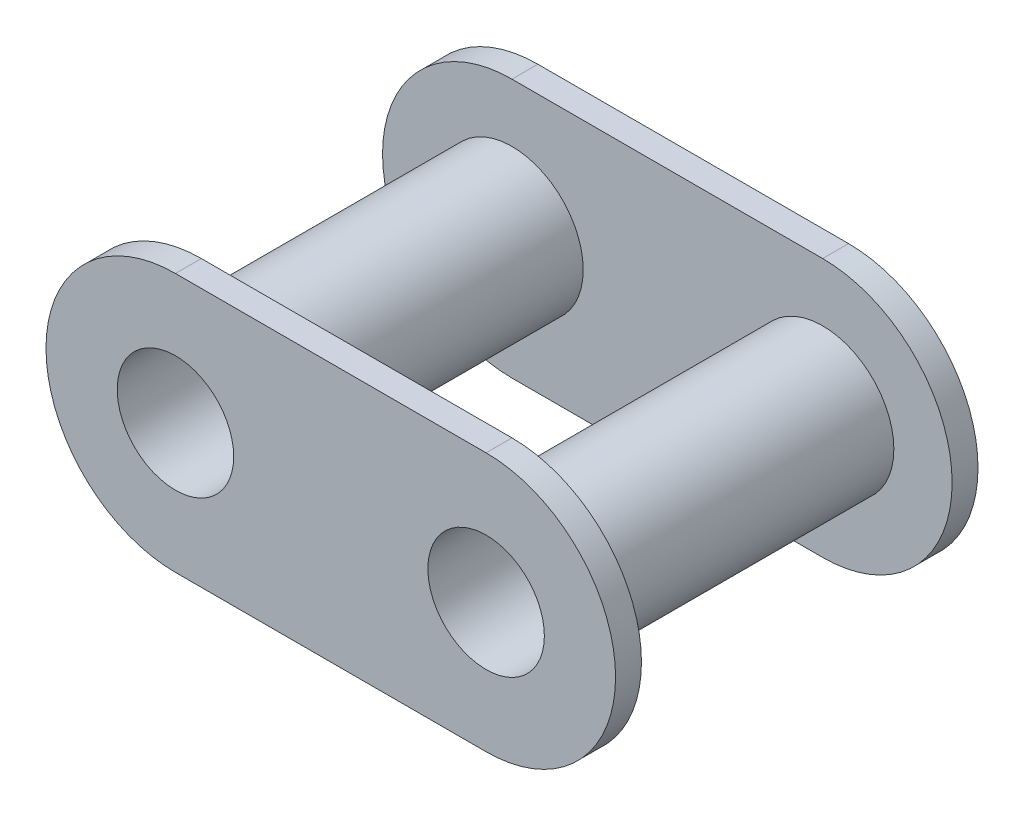
ISO-10303-21;
HEADER;
FILE_DESCRIPTION(('STEP AP214'),'2;1');
FILE_NAME('part.step','',(''),(''),'','','');
FILE_SCHEMA(('AUTOMOTIVE_DESIGN { 1 0 10303 214 1 1 1 1 }'));
ENDSEC;
DATA;
#1=APPLICATION_CONTEXT('core data for automotive mechanical design processes');
#2=APPLICATION_PROTOCOL_DEFINITION('international standard','automotive_design',2000,#1);
#3=PRODUCT_CONTEXT('',#1,'mechanical');
#4=PRODUCT('Part','Part','',(#3));
#5=PRODUCT_RELATED_PRODUCT_CATEGORY('part','',(#4));
#6=PRODUCT_DEFINITION_FORMATION('','',#4);
#7=PRODUCT_DEFINITION_CONTEXT('part definition',#1,'design');
#8=PRODUCT_DEFINITION('design','',#6,#7);
#9=PRODUCT_DEFINITION_SHAPE('','',#8);
#10=(LENGTH_UNIT() NAMED_UNIT(*) SI_UNIT(.MILLI.,.METRE.));
#11=(NAMED_UNIT(*) PLANE_ANGLE_UNIT() SI_UNIT($,.RADIAN.));
#12=(NAMED_UNIT(*) SI_UNIT($,.STERADIAN.) SOLID_ANGLE_UNIT());
#13=UNCERTAINTY_MEASURE_WITH_UNIT(LENGTH_MEASURE(1.E-05),#10,'distance_accuracy_value','');
#14=(GEOMETRIC_REPRESENTATION_CONTEXT(3) GLOBAL_UNCERTAINTY_ASSIGNED_CONTEXT((#13)) GLOBAL_UNIT_ASSIGNED_CONTEXT((#10,
#11,#12)) REPRESENTATION_CONTEXT('',''));
#15=CARTESIAN_POINT('',(0.,0.,0.));
#16=DIRECTION('',(0.,0.,1.));
#17=DIRECTION('',(1.,0.,0.));
#18=AXIS2_PLACEMENT_3D('',#15,#16,#17);
#19=CARTESIAN_POINT('',(-3.,0.,0.5));
#20=DIRECTION('',(0.,0.,1.));
#21=DIRECTION('',(1.,0.,0.));
#22=AXIS2_PLACEMENT_3D('',#19,#20,#21);
#23=PLANE('',#22);
#24=CARTESIAN_POINT('',(-3.,0.,0.5));
#25=DIRECTION('',(0.,0.,1.));
#26=DIRECTION('',(1.,0.,0.));
#27=AXIS2_PLACEMENT_3D('',#24,#25,#26);
#28=CIRCLE('',#27,1.375);
#29=CARTESIAN_POINT('',(-1.625,0.,0.5));
#30=VERTEX_POINT('',#29);
#31=EDGE_CURVE('E193',#30,#30,#28,.T.);
#32=ORIENTED_EDGE('',*,*,#31,.F.);
#33=EDGE_LOOP('',(#32));
#34=FACE_BOUND('',#33,.T.);
#35=CARTESIAN_POINT('',(-3.,0.,0.5));
#36=DIRECTION('',(0.,0.,1.));
#37=DIRECTION('',(1.,0.,0.));
#38=AXIS2_PLACEMENT_3D('',#35,#36,#37);
#39=CIRCLE('',#38,2.5);
#40=CARTESIAN_POINT('',(-3.,2.5,0.5));
#41=VERTEX_POINT('',#40);
#42=CARTESIAN_POINT('',(-3.,-2.5,0.5));
#43=VERTEX_POINT('',#42);
#44=EDGE_CURVE('E206',#41,#43,#39,.T.);
#45=ORIENTED_EDGE('',*,*,#44,.T.);
#46=DIRECTION('',(1.,0.,0.));
#47=VECTOR('',#46,1.);
#48=CARTESIAN_POINT('',(-3.,-2.5,0.5));
#49=LINE('',#48,#47);
#50=CARTESIAN_POINT('',(3.,-2.5,0.5));
#51=VERTEX_POINT('',#50);
#52=EDGE_CURVE('E104',#43,#51,#49,.T.);
#53=ORIENTED_EDGE('',*,*,#52,.T.);
#54=CARTESIAN_POINT('',(3.,0.,0.5));
#55=DIRECTION('',(0.,0.,1.));
#56=DIRECTION('',(1.,0.,0.));
#57=AXIS2_PLACEMENT_3D('',#54,#55,#56);
#58=CIRCLE('',#57,2.5);
#59=CARTESIAN_POINT('',(3.,2.5,0.5));
#60=VERTEX_POINT('',#59);
#61=EDGE_CURVE('E211',#51,#60,#58,.T.);
#62=ORIENTED_EDGE('',*,*,#61,.T.);
#63=DIRECTION('',(-1.,0.,0.));
#64=VECTOR('',#63,1.);
#65=CARTESIAN_POINT('',(-3.,2.5,0.5));
#66=LINE('',#65,#64);
#67=EDGE_CURVE('E73',#60,#41,#66,.T.);
#68=ORIENTED_EDGE('',*,*,#67,.T.);
#69=EDGE_LOOP('',(#45,#53,#62,#68));
#70=FACE_BOUND('',#69,.T.);
#71=CARTESIAN_POINT('',(3.,0.,0.5));
#72=DIRECTION('',(0.,0.,1.));
#73=DIRECTION('',(1.,0.,0.));
#74=AXIS2_PLACEMENT_3D('',#71,#72,#73);
#75=CIRCLE('',#74,1.375);
#76=CARTESIAN_POINT('',(4.375,0.,0.5));
#77=VERTEX_POINT('',#76);
#78=EDGE_CURVE('E143',#77,#77,#75,.T.);
#79=ORIENTED_EDGE('',*,*,#78,.F.);
#80=EDGE_LOOP('',(#79));
#81=FACE_BOUND('',#80,.T.);
#82=ADVANCED_FACE('F55',(#34,#70,#81),#23,.T.);
#83=CARTESIAN_POINT('',(-3.,0.,0.));
#84=DIRECTION('',(0.,0.,1.));
#85=DIRECTION('',(1.,0.,0.));
#86=AXIS2_PLACEMENT_3D('',#83,#84,#85);
#87=PLANE('',#86);
#88=CARTESIAN_POINT('',(-3.,0.,0.));
#89=DIRECTION('',(0.,0.,1.));
#90=DIRECTION('',(1.,0.,0.));
#91=AXIS2_PLACEMENT_3D('',#88,#89,#90);
#92=CIRCLE('',#91,2.5);
#93=CARTESIAN_POINT('',(-3.,2.5,0.));
#94=VERTEX_POINT('',#93);
#95=CARTESIAN_POINT('',(-3.,-2.5,0.));
#96=VERTEX_POINT('',#95);
#97=EDGE_CURVE('E205',#94,#96,#92,.T.);
#98=ORIENTED_EDGE('',*,*,#97,.F.);
#99=DIRECTION('',(-1.,0.,0.));
#100=VECTOR('',#99,1.);
#101=CARTESIAN_POINT('',(-3.,2.5,0.));
#102=LINE('',#101,#100);
#103=CARTESIAN_POINT('',(3.,2.5,0.));
#104=VERTEX_POINT('',#103);
#105=EDGE_CURVE('E97',#104,#94,#102,.T.);
#106=ORIENTED_EDGE('',*,*,#105,.F.);
#107=CARTESIAN_POINT('',(3.,0.,0.));
#108=DIRECTION('',(0.,0.,1.));
#109=DIRECTION('',(1.,0.,0.));
#110=AXIS2_PLACEMENT_3D('',#107,#108,#109);
#111=CIRCLE('',#110,2.5);
#112=CARTESIAN_POINT('',(3.,-2.5,0.));
#113=VERTEX_POINT('',#112);
#114=EDGE_CURVE('E91',#113,#104,#111,.T.);
#115=ORIENTED_EDGE('',*,*,#114,.F.);
#116=DIRECTION('',(1.,0.,0.));
#117=VECTOR('',#116,1.);
#118=CARTESIAN_POINT('',(-3.,-2.5,0.));
#119=LINE('',#118,#117);
#120=EDGE_CURVE('E220',#96,#113,#119,.T.);
#121=ORIENTED_EDGE('',*,*,#120,.F.);
#122=EDGE_LOOP('',(#98,#106,#115,#121));
#123=FACE_BOUND('',#122,.T.);
#124=CARTESIAN_POINT('',(-3.,0.,0.));
#125=DIRECTION('',(0.,0.,1.));
#126=DIRECTION('',(1.,0.,0.));
#127=AXIS2_PLACEMENT_3D('',#124,#125,#126);
#128=CIRCLE('',#127,1.125);
#129=CARTESIAN_POINT('',(-1.875,0.,0.));
#130=VERTEX_POINT('',#129);
#131=EDGE_CURVE('E201',#130,#130,#128,.T.);
#132=ORIENTED_EDGE('',*,*,#131,.T.);
#133=EDGE_LOOP('',(#132));
#134=FACE_BOUND('',#133,.T.);
#135=CARTESIAN_POINT('',(3.,0.,0.));
#136=DIRECTION('',(0.,0.,1.));
#137=DIRECTION('',(1.,0.,0.));
#138=AXIS2_PLACEMENT_3D('',#135,#136,#137);
#139=CIRCLE('',#138,1.125);
#140=CARTESIAN_POINT('',(4.125,0.,0.));
#141=VERTEX_POINT('',#140);
#142=EDGE_CURVE('E197',#141,#141,#139,.T.);
#143=ORIENTED_EDGE('',*,*,#142,.T.);
#144=EDGE_LOOP('',(#143));
#145=FACE_BOUND('',#144,.T.);
#146=ADVANCED_FACE('F236',(#123,#134,#145),#87,.F.);
#147=CARTESIAN_POINT('',(-3.,0.,0.5));
#148=DIRECTION('',(0.,0.,-1.));
#149=DIRECTION('',(-1.,0.,0.));
#150=AXIS2_PLACEMENT_3D('',#147,#148,#149);
#151=CYLINDRICAL_SURFACE('',#150,2.5);
#152=ORIENTED_EDGE('',*,*,#97,.T.);
#153=DIRECTION('',(0.,0.,-1.));
#154=VECTOR('',#153,1.);
#155=CARTESIAN_POINT('',(-3.,-2.5,0.5));
#156=LINE('',#155,#154);
#157=EDGE_CURVE('E12',#43,#96,#156,.T.);
#158=ORIENTED_EDGE('',*,*,#157,.F.);
#159=ORIENTED_EDGE('',*,*,#44,.F.);
#160=DIRECTION('',(0.,0.,-1.));
#161=VECTOR('',#160,1.);
#162=CARTESIAN_POINT('',(-3.,2.5,0.5));
#163=LINE('',#162,#161);
#164=EDGE_CURVE('E216',#41,#94,#163,.T.);
#165=ORIENTED_EDGE('',*,*,#164,.T.);
#166=EDGE_LOOP('',(#152,#158,#159,#165));
#167=FACE_BOUND('',#166,.T.);
#168=ADVANCED_FACE('F57',(#167),#151,.T.);
#169=CARTESIAN_POINT('',(-3.,-2.5,0.5));
#170=DIRECTION('',(0.,1.,0.));
#171=DIRECTION('',(-1.,0.,0.));
#172=AXIS2_PLACEMENT_3D('',#169,#170,#171);
#173=PLANE('',#172);
#174=ORIENTED_EDGE('',*,*,#120,.T.);
#175=DIRECTION('',(0.,0.,-1.));
#176=VECTOR('',#175,1.);
#177=CARTESIAN_POINT('',(3.,-2.5,0.5));
#178=LINE('',#177,#176);
#179=EDGE_CURVE('E65',#51,#113,#178,.T.);
#180=ORIENTED_EDGE('',*,*,#179,.F.);
#181=ORIENTED_EDGE('',*,*,#52,.F.);
#182=ORIENTED_EDGE('',*,*,#157,.T.);
#183=EDGE_LOOP('',(#174,#180,#181,#182));
#184=FACE_BOUND('',#183,.T.);
#185=ADVANCED_FACE('F252',(#184),#173,.F.);
#186=CARTESIAN_POINT('',(3.,0.,0.5));
#187=DIRECTION('',(0.,0.,-1.));
#188=DIRECTION('',(-1.,0.,0.));
#189=AXIS2_PLACEMENT_3D('',#186,#187,#188);
#190=CYLINDRICAL_SURFACE('',#189,2.5);
#191=ORIENTED_EDGE('',*,*,#114,.T.);
#192=DIRECTION('',(0.,0.,-1.));
#193=VECTOR('',#192,1.);
#194=CARTESIAN_POINT('',(3.,2.5,0.5));
#195=LINE('',#194,#193);
#196=EDGE_CURVE('E229',#60,#104,#195,.T.);
#197=ORIENTED_EDGE('',*,*,#196,.F.);
#198=ORIENTED_EDGE('',*,*,#61,.F.);
#199=ORIENTED_EDGE('',*,*,#179,.T.);
#200=EDGE_LOOP('',(#191,#197,#198,#199));
#201=FACE_BOUND('',#200,.T.);
#202=ADVANCED_FACE('F233',(#201),#190,.T.);
#203=CARTESIAN_POINT('',(-3.,2.5,0.5));
#204=DIRECTION('',(0.,-1.,0.));
#205=DIRECTION('',(1.,0.,0.));
#206=AXIS2_PLACEMENT_3D('',#203,#204,#205);
#207=PLANE('',#206);
#208=ORIENTED_EDGE('',*,*,#105,.T.);
#209=ORIENTED_EDGE('',*,*,#164,.F.);
#210=ORIENTED_EDGE('',*,*,#67,.F.);
#211=ORIENTED_EDGE('',*,*,#196,.T.);
#212=EDGE_LOOP('',(#208,#209,#210,#211));
#213=FACE_BOUND('',#212,.T.);
#214=ADVANCED_FACE('F241',(#213),#207,.F.);
#215=CARTESIAN_POINT('',(-3.,0.,0.5));
#216=DIRECTION('',(0.,0.,-1.));
#217=DIRECTION('',(-1.,0.,0.));
#218=AXIS2_PLACEMENT_3D('',#215,#216,#217);
#219=CYLINDRICAL_SURFACE('',#218,1.125);
#220=ORIENTED_EDGE('',*,*,#131,.F.);
#221=EDGE_LOOP('',(#220));
#222=FACE_BOUND('',#221,.T.);
#223=CARTESIAN_POINT('',(-3.,0.,7.));
#224=DIRECTION('',(0.,0.,1.));
#225=DIRECTION('',(1.,0.,0.));
#226=AXIS2_PLACEMENT_3D('',#223,#224,#225);
#227=CIRCLE('',#226,1.125);
#228=CARTESIAN_POINT('',(-1.875,0.,7.));
#229=VERTEX_POINT('',#228);
#230=EDGE_CURVE('E167',#229,#229,#227,.T.);
#231=ORIENTED_EDGE('',*,*,#230,.T.);
#232=EDGE_LOOP('',(#231));
#233=FACE_BOUND('',#232,.T.);
#234=ADVANCED_FACE('F243',(#222,#233),#219,.F.);
#235=CARTESIAN_POINT('',(3.,0.,0.5));
#236=DIRECTION('',(0.,0.,-1.));
#237=DIRECTION('',(-1.,0.,0.));
#238=AXIS2_PLACEMENT_3D('',#235,#236,#237);
#239=CYLINDRICAL_SURFACE('',#238,1.125);
#240=ORIENTED_EDGE('',*,*,#142,.F.);
#241=EDGE_LOOP('',(#240));
#242=FACE_BOUND('',#241,.T.);
#243=CARTESIAN_POINT('',(3.,0.,7.));
#244=DIRECTION('',(0.,0.,1.));
#245=DIRECTION('',(1.,0.,0.));
#246=AXIS2_PLACEMENT_3D('',#243,#244,#245);
#247=CIRCLE('',#246,1.125);
#248=CARTESIAN_POINT('',(4.125,0.,7.));
#249=VERTEX_POINT('',#248);
#250=EDGE_CURVE('E299',#249,#249,#247,.T.);
#251=ORIENTED_EDGE('',*,*,#250,.T.);
#252=EDGE_LOOP('',(#251));
#253=FACE_BOUND('',#252,.T.);
#254=ADVANCED_FACE('F249',(#242,#253),#239,.F.);
#255=CARTESIAN_POINT('',(-3.,0.,3.5));
#256=DIRECTION('',(0.,0.,-1.));
#257=DIRECTION('',(-1.,0.,0.));
#258=AXIS2_PLACEMENT_3D('',#255,#256,#257);
#259=CYLINDRICAL_SURFACE('',#258,1.375);
#260=ORIENTED_EDGE('',*,*,#31,.T.);
#261=EDGE_LOOP('',(#260));
#262=FACE_BOUND('',#261,.T.);
#263=CARTESIAN_POINT('',(-3.,0.,6.5));
#264=DIRECTION('',(0.,0.,1.));
#265=DIRECTION('',(1.,0.,0.));
#266=AXIS2_PLACEMENT_3D('',#263,#264,#265);
#267=CIRCLE('',#266,1.375);
#268=CARTESIAN_POINT('',(-1.625,0.,6.5));
#269=VERTEX_POINT('',#268);
#270=EDGE_CURVE('E296',#269,#269,#267,.T.);
#271=ORIENTED_EDGE('',*,*,#270,.F.);
#272=EDGE_LOOP('',(#271));
#273=FACE_BOUND('',#272,.T.);
#274=ADVANCED_FACE('F265',(#262,#273),#259,.T.);
#275=CARTESIAN_POINT('',(3.,0.,3.5));
#276=DIRECTION('',(0.,0.,-1.));
#277=DIRECTION('',(-1.,0.,0.));
#278=AXIS2_PLACEMENT_3D('',#275,#276,#277);
#279=CYLINDRICAL_SURFACE('',#278,1.375);
#280=ORIENTED_EDGE('',*,*,#78,.T.);
#281=EDGE_LOOP('',(#280));
#282=FACE_BOUND('',#281,.T.);
#283=CARTESIAN_POINT('',(3.,0.,6.5));
#284=DIRECTION('',(0.,0.,1.));
#285=DIRECTION('',(1.,0.,0.));
#286=AXIS2_PLACEMENT_3D('',#283,#284,#285);
#287=CIRCLE('',#286,1.375);
#288=CARTESIAN_POINT('',(4.375,0.,6.5));
#289=VERTEX_POINT('',#288);
#290=EDGE_CURVE('E300',#289,#289,#287,.T.);
#291=ORIENTED_EDGE('',*,*,#290,.F.);
#292=EDGE_LOOP('',(#291));
#293=FACE_BOUND('',#292,.T.);
#294=ADVANCED_FACE('F269',(#282,#293),#279,.T.);
#295=CARTESIAN_POINT('',(-3.,0.,6.5));
#296=DIRECTION('',(0.,0.,-1.));
#297=DIRECTION('',(1.,0.,0.));
#298=AXIS2_PLACEMENT_3D('',#295,#296,#297);
#299=PLANE('',#298);
#300=ORIENTED_EDGE('',*,*,#270,.T.);
#301=EDGE_LOOP('',(#300));
#302=FACE_BOUND('',#301,.T.);
#303=CARTESIAN_POINT('',(-3.,0.,6.5));
#304=DIRECTION('',(0.,0.,1.));
#305=DIRECTION('',(1.,0.,0.));
#306=AXIS2_PLACEMENT_3D('',#303,#304,#305);
#307=CIRCLE('',#306,2.5);
#308=CARTESIAN_POINT('',(-3.,2.5,6.5));
#309=VERTEX_POINT('',#308);
#310=CARTESIAN_POINT('',(-3.,-2.5,6.5));
#311=VERTEX_POINT('',#310);
#312=EDGE_CURVE('E151',#309,#311,#307,.T.);
#313=ORIENTED_EDGE('',*,*,#312,.F.);
#314=DIRECTION('',(-1.,0.,0.));
#315=VECTOR('',#314,1.);
#316=CARTESIAN_POINT('',(-3.,2.5,6.5));
#317=LINE('',#316,#315);
#318=CARTESIAN_POINT('',(3.,2.5,6.5));
#319=VERTEX_POINT('',#318);
#320=EDGE_CURVE('E172',#319,#309,#317,.T.);
#321=ORIENTED_EDGE('',*,*,#320,.F.);
#322=CARTESIAN_POINT('',(3.,0.,6.5));
#323=DIRECTION('',(0.,0.,1.));
#324=DIRECTION('',(1.,0.,0.));
#325=AXIS2_PLACEMENT_3D('',#322,#323,#324);
#326=CIRCLE('',#325,2.5);
#327=CARTESIAN_POINT('',(3.,-2.5,6.5));
#328=VERTEX_POINT('',#327);
#329=EDGE_CURVE('E153',#328,#319,#326,.T.);
#330=ORIENTED_EDGE('',*,*,#329,.F.);
#331=DIRECTION('',(1.,0.,0.));
#332=VECTOR('',#331,1.);
#333=CARTESIAN_POINT('',(-3.,-2.5,6.5));
#334=LINE('',#333,#332);
#335=EDGE_CURVE('E134',#311,#328,#334,.T.);
#336=ORIENTED_EDGE('',*,*,#335,.F.);
#337=EDGE_LOOP('',(#313,#321,#330,#336));
#338=FACE_BOUND('',#337,.T.);
#339=ORIENTED_EDGE('',*,*,#290,.T.);
#340=EDGE_LOOP('',(#339));
#341=FACE_BOUND('',#340,.T.);
#342=ADVANCED_FACE('F148',(#302,#338,#341),#299,.T.);
#343=CARTESIAN_POINT('',(-3.,0.,7.));
#344=DIRECTION('',(0.,0.,-1.));
#345=DIRECTION('',(1.,0.,0.));
#346=AXIS2_PLACEMENT_3D('',#343,#344,#345);
#347=PLANE('',#346);
#348=CARTESIAN_POINT('',(-3.,0.,7.));
#349=DIRECTION('',(0.,0.,1.));
#350=DIRECTION('',(1.,0.,0.));
#351=AXIS2_PLACEMENT_3D('',#348,#349,#350);
#352=CIRCLE('',#351,2.5);
#353=CARTESIAN_POINT('',(-3.,2.5,7.));
#354=VERTEX_POINT('',#353);
#355=CARTESIAN_POINT('',(-3.,-2.5,7.));
#356=VERTEX_POINT('',#355);
#357=EDGE_CURVE('E175',#354,#356,#352,.T.);
#358=ORIENTED_EDGE('',*,*,#357,.T.);
#359=DIRECTION('',(1.,0.,0.));
#360=VECTOR('',#359,1.);
#361=CARTESIAN_POINT('',(-3.,-2.5,7.));
#362=LINE('',#361,#360);
#363=CARTESIAN_POINT('',(3.,-2.5,7.));
#364=VERTEX_POINT('',#363);
#365=EDGE_CURVE('E137',#356,#364,#362,.T.);
#366=ORIENTED_EDGE('',*,*,#365,.T.);
#367=CARTESIAN_POINT('',(3.,0.,7.));
#368=DIRECTION('',(0.,0.,1.));
#369=DIRECTION('',(1.,0.,0.));
#370=AXIS2_PLACEMENT_3D('',#367,#368,#369);
#371=CIRCLE('',#370,2.5);
#372=CARTESIAN_POINT('',(3.,2.5,7.));
#373=VERTEX_POINT('',#372);
#374=EDGE_CURVE('E164',#364,#373,#371,.T.);
#375=ORIENTED_EDGE('',*,*,#374,.T.);
#376=DIRECTION('',(-1.,0.,0.));
#377=VECTOR('',#376,1.);
#378=CARTESIAN_POINT('',(-3.,2.5,7.));
#379=LINE('',#378,#377);
#380=EDGE_CURVE('E160',#373,#354,#379,.T.);
#381=ORIENTED_EDGE('',*,*,#380,.T.);
#382=EDGE_LOOP('',(#358,#366,#375,#381));
#383=FACE_BOUND('',#382,.T.);
#384=ORIENTED_EDGE('',*,*,#230,.F.);
#385=EDGE_LOOP('',(#384));
#386=FACE_BOUND('',#385,.T.);
#387=ORIENTED_EDGE('',*,*,#250,.F.);
#388=EDGE_LOOP('',(#387));
#389=FACE_BOUND('',#388,.T.);
#390=ADVANCED_FACE('F276',(#383,#386,#389),#347,.F.);
#391=CARTESIAN_POINT('',(-3.,0.,6.5));
#392=DIRECTION('',(0.,0.,1.));
#393=DIRECTION('',(-1.,0.,0.));
#394=AXIS2_PLACEMENT_3D('',#391,#392,#393);
#395=CYLINDRICAL_SURFACE('',#394,2.5);
#396=ORIENTED_EDGE('',*,*,#357,.F.);
#397=DIRECTION('',(0.,0.,1.));
#398=VECTOR('',#397,1.);
#399=CARTESIAN_POINT('',(-3.,2.5,6.5));
#400=LINE('',#399,#398);
#401=EDGE_CURVE('E157',#309,#354,#400,.T.);
#402=ORIENTED_EDGE('',*,*,#401,.F.);
#403=ORIENTED_EDGE('',*,*,#312,.T.);
#404=DIRECTION('',(0.,0.,1.));
#405=VECTOR('',#404,1.);
#406=CARTESIAN_POINT('',(-3.,-2.5,6.5));
#407=LINE('',#406,#405);
#408=EDGE_CURVE('E131',#311,#356,#407,.T.);
#409=ORIENTED_EDGE('',*,*,#408,.T.);
#410=EDGE_LOOP('',(#396,#402,#403,#409));
#411=FACE_BOUND('',#410,.T.);
#412=ADVANCED_FACE('F156',(#411),#395,.T.);
#413=CARTESIAN_POINT('',(-3.,-2.5,6.5));
#414=DIRECTION('',(0.,1.,0.));
#415=DIRECTION('',(-1.,0.,0.));
#416=AXIS2_PLACEMENT_3D('',#413,#414,#415);
#417=PLANE('',#416);
#418=ORIENTED_EDGE('',*,*,#365,.F.);
#419=ORIENTED_EDGE('',*,*,#408,.F.);
#420=ORIENTED_EDGE('',*,*,#335,.T.);
#421=DIRECTION('',(0.,0.,1.));
#422=VECTOR('',#421,1.);
#423=CARTESIAN_POINT('',(3.,-2.5,6.5));
#424=LINE('',#423,#422);
#425=EDGE_CURVE('E144',#328,#364,#424,.T.);
#426=ORIENTED_EDGE('',*,*,#425,.T.);
#427=EDGE_LOOP('',(#418,#419,#420,#426));
#428=FACE_BOUND('',#427,.T.);
#429=ADVANCED_FACE('F133',(#428),#417,.F.);
#430=CARTESIAN_POINT('',(3.,0.,6.5));
#431=DIRECTION('',(0.,0.,1.));
#432=DIRECTION('',(-1.,0.,0.));
#433=AXIS2_PLACEMENT_3D('',#430,#431,#432);
#434=CYLINDRICAL_SURFACE('',#433,2.5);
#435=ORIENTED_EDGE('',*,*,#374,.F.);
#436=ORIENTED_EDGE('',*,*,#425,.F.);
#437=ORIENTED_EDGE('',*,*,#329,.T.);
#438=DIRECTION('',(0.,0.,1.));
#439=VECTOR('',#438,1.);
#440=CARTESIAN_POINT('',(3.,2.5,6.5));
#441=LINE('',#440,#439);
#442=EDGE_CURVE('E185',#319,#373,#441,.T.);
#443=ORIENTED_EDGE('',*,*,#442,.T.);
#444=EDGE_LOOP('',(#435,#436,#437,#443));
#445=FACE_BOUND('',#444,.T.);
#446=ADVANCED_FACE('F279',(#445),#434,.T.);
#447=CARTESIAN_POINT('',(-3.,2.5,6.5));
#448=DIRECTION('',(0.,-1.,0.));
#449=DIRECTION('',(1.,0.,0.));
#450=AXIS2_PLACEMENT_3D('',#447,#448,#449);
#451=PLANE('',#450);
#452=ORIENTED_EDGE('',*,*,#380,.F.);
#453=ORIENTED_EDGE('',*,*,#442,.F.);
#454=ORIENTED_EDGE('',*,*,#320,.T.);
#455=ORIENTED_EDGE('',*,*,#401,.T.);
#456=EDGE_LOOP('',(#452,#453,#454,#455));
#457=FACE_BOUND('',#456,.T.);
#458=ADVANCED_FACE('F282',(#457),#451,.F.);
#459=CLOSED_SHELL('',(#82,#146,#168,#185,#202,#214,#234,#254,#274,#294,#342,#390,#412,#429,#446,#458));
#460=MANIFOLD_SOLID_BREP('B2',#459);
#461=ADVANCED_BREP_SHAPE_REPRESENTATION('',(#18,#460),#14);
#462=SHAPE_DEFINITION_REPRESENTATION(#9,#461);
ENDSEC;
END-ISO-10303-21;
